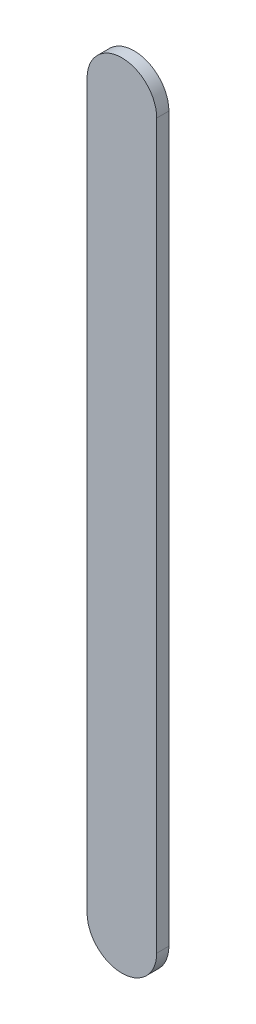
ISO-10303-21;
HEADER;
FILE_DESCRIPTION(('STEP AP214'),'2;1');
FILE_NAME('part.step','',(''),(''),'','','');
FILE_SCHEMA(('AUTOMOTIVE_DESIGN { 1 0 10303 214 1 1 1 1 }'));
ENDSEC;
DATA;
#1=APPLICATION_CONTEXT('core data for automotive mechanical design processes');
#2=APPLICATION_PROTOCOL_DEFINITION('international standard','automotive_design',2000,#1);
#3=PRODUCT_CONTEXT('',#1,'mechanical');
#4=PRODUCT('Part','Part','',(#3));
#5=PRODUCT_RELATED_PRODUCT_CATEGORY('part','',(#4));
#6=PRODUCT_DEFINITION_FORMATION('','',#4);
#7=PRODUCT_DEFINITION_CONTEXT('part definition',#1,'design');
#8=PRODUCT_DEFINITION('design','',#6,#7);
#9=PRODUCT_DEFINITION_SHAPE('','',#8);
#10=(LENGTH_UNIT() NAMED_UNIT(*) SI_UNIT(.MILLI.,.METRE.));
#11=(NAMED_UNIT(*) PLANE_ANGLE_UNIT() SI_UNIT($,.RADIAN.));
#12=(NAMED_UNIT(*) SI_UNIT($,.STERADIAN.) SOLID_ANGLE_UNIT());
#13=UNCERTAINTY_MEASURE_WITH_UNIT(LENGTH_MEASURE(1.E-05),#10,'distance_accuracy_value','');
#14=(GEOMETRIC_REPRESENTATION_CONTEXT(3) GLOBAL_UNCERTAINTY_ASSIGNED_CONTEXT((#13)) GLOBAL_UNIT_ASSIGNED_CONTEXT((#10,
#11,#12)) REPRESENTATION_CONTEXT('',''));
#15=CARTESIAN_POINT('',(0.,0.,0.));
#16=DIRECTION('',(0.,0.,1.));
#17=DIRECTION('',(1.,0.,0.));
#18=AXIS2_PLACEMENT_3D('',#15,#16,#17);
#19=CARTESIAN_POINT('',(85.075,-117.025,1.635));
#20=DIRECTION('',(0.,0.,1.));
#21=DIRECTION('',(1.,0.,0.));
#22=AXIS2_PLACEMENT_3D('',#19,#20,#21);
#23=PLANE('',#22);
#24=DIRECTION('',(0.,-1.,0.));
#25=VECTOR('',#24,1.);
#26=CARTESIAN_POINT('',(85.075,-117.025,1.635));
#27=LINE('',#26,#25);
#28=CARTESIAN_POINT('',(85.075,-117.025,1.635));
#29=VERTEX_POINT('',#28);
#30=CARTESIAN_POINT('',(85.075,-119.102942,1.635));
#31=VERTEX_POINT('',#30);
#32=EDGE_CURVE('E79',#29,#31,#27,.T.);
#33=ORIENTED_EDGE('',*,*,#32,.T.);
#34=CARTESIAN_POINT('',(85.175,-119.102942,1.635));
#35=DIRECTION('',(0.,0.,1.));
#36=DIRECTION('',(-1.,0.,0.));
#37=AXIS2_PLACEMENT_3D('',#34,#35,#36);
#38=CIRCLE('',#37,0.1);
#39=CARTESIAN_POINT('',(85.275,-119.102942,1.635));
#40=VERTEX_POINT('',#39);
#41=EDGE_CURVE('E97',#31,#40,#38,.T.);
#42=ORIENTED_EDGE('',*,*,#41,.T.);
#43=DIRECTION('',(0.,1.,0.));
#44=VECTOR('',#43,1.);
#45=CARTESIAN_POINT('',(85.275,-119.102942,1.635));
#46=LINE('',#45,#44);
#47=CARTESIAN_POINT('',(85.275,-117.025,1.635));
#48=VERTEX_POINT('',#47);
#49=EDGE_CURVE('E72',#40,#48,#46,.T.);
#50=ORIENTED_EDGE('',*,*,#49,.T.);
#51=CARTESIAN_POINT('',(85.175,-117.025,1.635));
#52=DIRECTION('',(0.,0.,1.));
#53=DIRECTION('',(1.,-1.42108547152E-13,0.));
#54=AXIS2_PLACEMENT_3D('',#51,#52,#53);
#55=CIRCLE('',#54,0.1);
#56=EDGE_CURVE('E11',#48,#29,#55,.T.);
#57=ORIENTED_EDGE('',*,*,#56,.T.);
#58=EDGE_LOOP('',(#33,#42,#50,#57));
#59=FACE_BOUND('',#58,.T.);
#60=ADVANCED_FACE('F17',(#59),#23,.T.);
#61=CARTESIAN_POINT('',(85.075,-117.025,1.6));
#62=DIRECTION('',(0.,0.,1.));
#63=DIRECTION('',(1.,0.,0.));
#64=AXIS2_PLACEMENT_3D('',#61,#62,#63);
#65=PLANE('',#64);
#66=CARTESIAN_POINT('',(85.175,-117.025,1.6));
#67=DIRECTION('',(0.,0.,1.));
#68=DIRECTION('',(1.,-1.42108547152E-13,0.));
#69=AXIS2_PLACEMENT_3D('',#66,#67,#68);
#70=CIRCLE('',#69,0.1);
#71=CARTESIAN_POINT('',(85.275,-117.025,1.6));
#72=VERTEX_POINT('',#71);
#73=CARTESIAN_POINT('',(85.075,-117.025,1.6));
#74=VERTEX_POINT('',#73);
#75=EDGE_CURVE('E26',#72,#74,#70,.T.);
#76=ORIENTED_EDGE('',*,*,#75,.F.);
#77=DIRECTION('',(0.,1.,0.));
#78=VECTOR('',#77,1.);
#79=CARTESIAN_POINT('',(85.275,-119.102942,1.6));
#80=LINE('',#79,#78);
#81=CARTESIAN_POINT('',(85.275,-119.102942,1.6));
#82=VERTEX_POINT('',#81);
#83=EDGE_CURVE('E101',#82,#72,#80,.T.);
#84=ORIENTED_EDGE('',*,*,#83,.F.);
#85=CARTESIAN_POINT('',(85.175,-119.102942,1.6));
#86=DIRECTION('',(0.,0.,1.));
#87=DIRECTION('',(-1.,0.,0.));
#88=AXIS2_PLACEMENT_3D('',#85,#86,#87);
#89=CIRCLE('',#88,0.1);
#90=CARTESIAN_POINT('',(85.075,-119.102942,1.6));
#91=VERTEX_POINT('',#90);
#92=EDGE_CURVE('E81',#91,#82,#89,.T.);
#93=ORIENTED_EDGE('',*,*,#92,.F.);
#94=DIRECTION('',(0.,-1.,0.));
#95=VECTOR('',#94,1.);
#96=CARTESIAN_POINT('',(85.075,-117.025,1.6));
#97=LINE('',#96,#95);
#98=EDGE_CURVE('E77',#74,#91,#97,.T.);
#99=ORIENTED_EDGE('',*,*,#98,.F.);
#100=EDGE_LOOP('',(#76,#84,#93,#99));
#101=FACE_BOUND('',#100,.T.);
#102=ADVANCED_FACE('F83',(#101),#65,.F.);
#103=CARTESIAN_POINT('',(85.175,-117.025,1.6));
#104=DIRECTION('',(0.,0.,-1.));
#105=DIRECTION('',(1.,-1.42108547152E-13,0.));
#106=AXIS2_PLACEMENT_3D('',#103,#104,#105);
#107=CYLINDRICAL_SURFACE('',#106,0.1);
#108=ORIENTED_EDGE('',*,*,#75,.T.);
#109=DIRECTION('',(0.,0.,1.));
#110=VECTOR('',#109,1.);
#111=CARTESIAN_POINT('',(85.075,-117.025,1.6));
#112=LINE('',#111,#110);
#113=EDGE_CURVE('E64',#74,#29,#112,.T.);
#114=ORIENTED_EDGE('',*,*,#113,.T.);
#115=ORIENTED_EDGE('',*,*,#56,.F.);
#116=DIRECTION('',(0.,0.,1.));
#117=VECTOR('',#116,1.);
#118=CARTESIAN_POINT('',(85.275,-117.025,1.6));
#119=LINE('',#118,#117);
#120=EDGE_CURVE('E67',#72,#48,#119,.T.);
#121=ORIENTED_EDGE('',*,*,#120,.F.);
#122=EDGE_LOOP('',(#108,#114,#115,#121));
#123=FACE_BOUND('',#122,.T.);
#124=ADVANCED_FACE('F63',(#123),#107,.T.);
#125=CARTESIAN_POINT('',(85.275,-119.102942,1.6));
#126=DIRECTION('',(-1.,0.,0.));
#127=DIRECTION('',(0.,0.,1.));
#128=AXIS2_PLACEMENT_3D('',#125,#126,#127);
#129=PLANE('',#128);
#130=ORIENTED_EDGE('',*,*,#83,.T.);
#131=ORIENTED_EDGE('',*,*,#120,.T.);
#132=ORIENTED_EDGE('',*,*,#49,.F.);
#133=DIRECTION('',(0.,0.,1.));
#134=VECTOR('',#133,1.);
#135=CARTESIAN_POINT('',(85.275,-119.102942,1.6));
#136=LINE('',#135,#134);
#137=EDGE_CURVE('E102',#82,#40,#136,.T.);
#138=ORIENTED_EDGE('',*,*,#137,.F.);
#139=EDGE_LOOP('',(#130,#131,#132,#138));
#140=FACE_BOUND('',#139,.T.);
#141=ADVANCED_FACE('F118',(#140),#129,.F.);
#142=CARTESIAN_POINT('',(85.175,-119.102942,1.6));
#143=DIRECTION('',(0.,0.,-1.));
#144=DIRECTION('',(-1.,0.,0.));
#145=AXIS2_PLACEMENT_3D('',#142,#143,#144);
#146=CYLINDRICAL_SURFACE('',#145,0.1);
#147=ORIENTED_EDGE('',*,*,#92,.T.);
#148=ORIENTED_EDGE('',*,*,#137,.T.);
#149=ORIENTED_EDGE('',*,*,#41,.F.);
#150=DIRECTION('',(0.,0.,1.));
#151=VECTOR('',#150,1.);
#152=CARTESIAN_POINT('',(85.075,-119.102942,1.6));
#153=LINE('',#152,#151);
#154=EDGE_CURVE('E87',#91,#31,#153,.T.);
#155=ORIENTED_EDGE('',*,*,#154,.F.);
#156=EDGE_LOOP('',(#147,#148,#149,#155));
#157=FACE_BOUND('',#156,.T.);
#158=ADVANCED_FACE('F120',(#157),#146,.T.);
#159=CARTESIAN_POINT('',(85.075,-117.025,1.6));
#160=DIRECTION('',(1.,0.,0.));
#161=DIRECTION('',(0.,1.,0.));
#162=AXIS2_PLACEMENT_3D('',#159,#160,#161);
#163=PLANE('',#162);
#164=ORIENTED_EDGE('',*,*,#98,.T.);
#165=ORIENTED_EDGE('',*,*,#154,.T.);
#166=ORIENTED_EDGE('',*,*,#32,.F.);
#167=ORIENTED_EDGE('',*,*,#113,.F.);
#168=EDGE_LOOP('',(#164,#165,#166,#167));
#169=FACE_BOUND('',#168,.T.);
#170=ADVANCED_FACE('F75',(#169),#163,.F.);
#171=CLOSED_SHELL('',(#60,#102,#124,#141,#158,#170));
#172=MANIFOLD_SOLID_BREP('B1',#171);
#173=ADVANCED_BREP_SHAPE_REPRESENTATION('',(#18,#172),#14);
#174=SHAPE_DEFINITION_REPRESENTATION(#9,#173);
ENDSEC;
END-ISO-10303-21;
